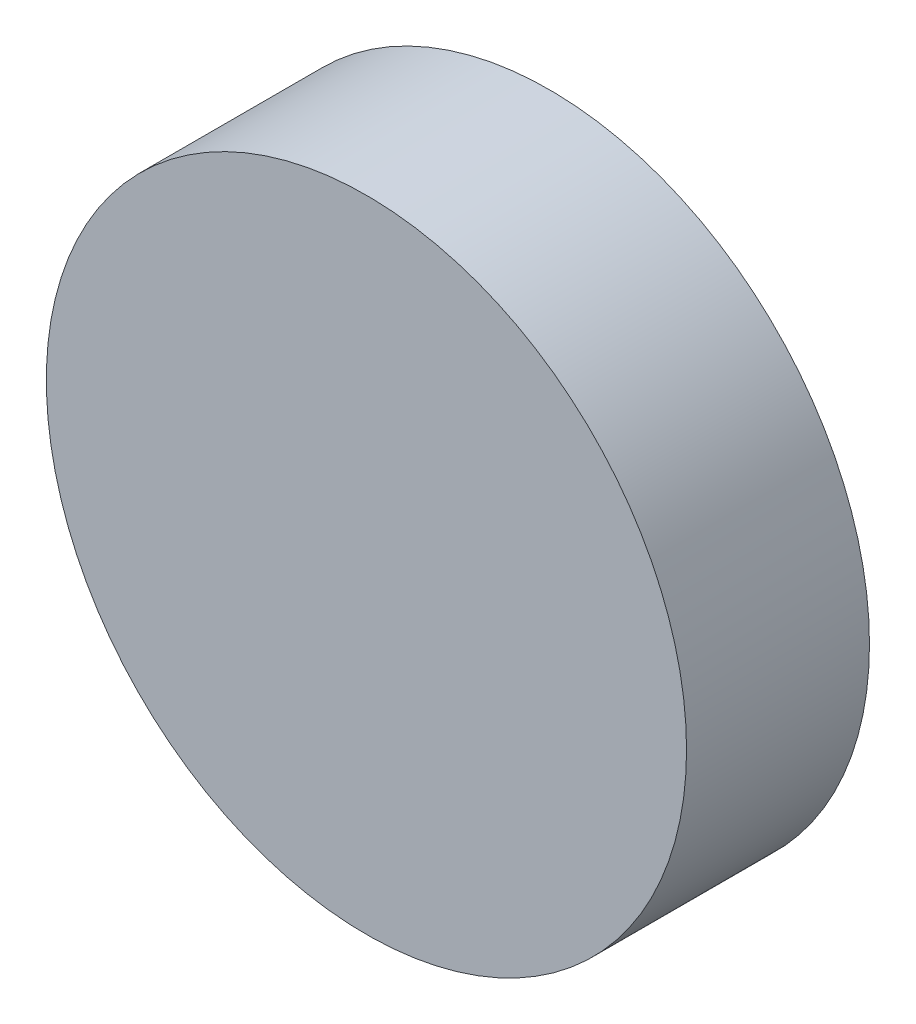
ISO-10303-21;
HEADER;
FILE_DESCRIPTION(('STEP AP214'),'2;1');
FILE_NAME('part.step','',(''),(''),'','','');
FILE_SCHEMA(('AUTOMOTIVE_DESIGN { 1 0 10303 214 1 1 1 1 }'));
ENDSEC;
DATA;
#1=APPLICATION_CONTEXT('core data for automotive mechanical design processes');
#2=APPLICATION_PROTOCOL_DEFINITION('international standard','automotive_design',2000,#1);
#3=PRODUCT_CONTEXT('',#1,'mechanical');
#4=PRODUCT('Part','Part','',(#3));
#5=PRODUCT_RELATED_PRODUCT_CATEGORY('part','',(#4));
#6=PRODUCT_DEFINITION_FORMATION('','',#4);
#7=PRODUCT_DEFINITION_CONTEXT('part definition',#1,'design');
#8=PRODUCT_DEFINITION('design','',#6,#7);
#9=PRODUCT_DEFINITION_SHAPE('','',#8);
#10=(LENGTH_UNIT() NAMED_UNIT(*) SI_UNIT(.MILLI.,.METRE.));
#11=(NAMED_UNIT(*) PLANE_ANGLE_UNIT() SI_UNIT($,.RADIAN.));
#12=(NAMED_UNIT(*) SI_UNIT($,.STERADIAN.) SOLID_ANGLE_UNIT());
#13=UNCERTAINTY_MEASURE_WITH_UNIT(LENGTH_MEASURE(1.E-05),#10,'distance_accuracy_value','');
#14=(GEOMETRIC_REPRESENTATION_CONTEXT(3) GLOBAL_UNCERTAINTY_ASSIGNED_CONTEXT((#13)) GLOBAL_UNIT_ASSIGNED_CONTEXT((#10,
#11,#12)) REPRESENTATION_CONTEXT('',''));
#15=CARTESIAN_POINT('',(0.,0.,0.));
#16=DIRECTION('',(0.,0.,1.));
#17=DIRECTION('',(1.,0.,0.));
#18=AXIS2_PLACEMENT_3D('',#15,#16,#17);
#19=CARTESIAN_POINT('',(0.,0.,20.));
#20=DIRECTION('',(0.,0.,-1.));
#21=DIRECTION('',(-1.,0.,0.));
#22=AXIS2_PLACEMENT_3D('',#19,#20,#21);
#23=CYLINDRICAL_SURFACE('',#22,35.);
#24=CARTESIAN_POINT('',(0.,0.,20.));
#25=DIRECTION('',(0.,0.,1.));
#26=DIRECTION('',(1.,0.,0.));
#27=AXIS2_PLACEMENT_3D('',#24,#25,#26);
#28=CIRCLE('',#27,35.);
#29=CARTESIAN_POINT('',(35.,0.,20.));
#30=VERTEX_POINT('',#29);
#31=EDGE_CURVE('E10',#30,#30,#28,.T.);
#32=ORIENTED_EDGE('',*,*,#31,.F.);
#33=EDGE_LOOP('',(#32));
#34=FACE_BOUND('',#33,.T.);
#35=CARTESIAN_POINT('',(0.,0.,0.));
#36=DIRECTION('',(0.,0.,1.));
#37=DIRECTION('',(1.,0.,0.));
#38=AXIS2_PLACEMENT_3D('',#35,#36,#37);
#39=CIRCLE('',#38,35.);
#40=CARTESIAN_POINT('',(35.,0.,0.));
#41=VERTEX_POINT('',#40);
#42=EDGE_CURVE('E34',#41,#41,#39,.T.);
#43=ORIENTED_EDGE('',*,*,#42,.T.);
#44=EDGE_LOOP('',(#43));
#45=FACE_BOUND('',#44,.T.);
#46=ADVANCED_FACE('F31',(#34,#45),#23,.T.);
#47=CARTESIAN_POINT('',(0.,0.,20.));
#48=DIRECTION('',(0.,0.,1.));
#49=DIRECTION('',(1.,0.,0.));
#50=AXIS2_PLACEMENT_3D('',#47,#48,#49);
#51=PLANE('',#50);
#52=ORIENTED_EDGE('',*,*,#31,.T.);
#53=EDGE_LOOP('',(#52));
#54=FACE_BOUND('',#53,.T.);
#55=ADVANCED_FACE('F46',(#54),#51,.T.);
#56=CARTESIAN_POINT('',(0.,0.,0.));
#57=DIRECTION('',(0.,0.,1.));
#58=DIRECTION('',(1.,0.,0.));
#59=AXIS2_PLACEMENT_3D('',#56,#57,#58);
#60=PLANE('',#59);
#61=ORIENTED_EDGE('',*,*,#42,.F.);
#62=EDGE_LOOP('',(#61));
#63=FACE_BOUND('',#62,.T.);
#64=ADVANCED_FACE('F44',(#63),#60,.F.);
#65=CLOSED_SHELL('',(#46,#55,#64));
#66=MANIFOLD_SOLID_BREP('B2',#65);
#67=ADVANCED_BREP_SHAPE_REPRESENTATION('',(#18,#66),#14);
#68=SHAPE_DEFINITION_REPRESENTATION(#9,#67);
ENDSEC;
END-ISO-10303-21;
